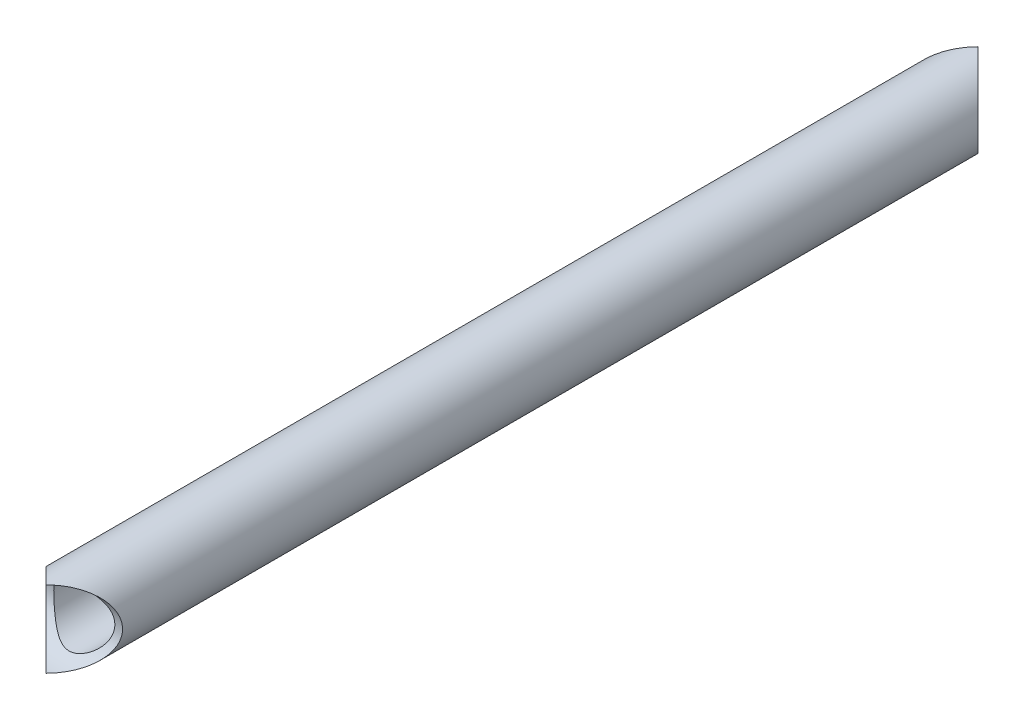
ISO-10303-21;
HEADER;
FILE_DESCRIPTION(('STEP AP214'),'2;1');
FILE_NAME('part.step','',(''),(''),'','','');
FILE_SCHEMA(('AUTOMOTIVE_DESIGN { 1 0 10303 214 1 1 1 1 }'));
ENDSEC;
DATA;
#1=APPLICATION_CONTEXT('core data for automotive mechanical design processes');
#2=APPLICATION_PROTOCOL_DEFINITION('international standard','automotive_design',2000,#1);
#3=PRODUCT_CONTEXT('',#1,'mechanical');
#4=PRODUCT('Part','Part','',(#3));
#5=PRODUCT_RELATED_PRODUCT_CATEGORY('part','',(#4));
#6=PRODUCT_DEFINITION_FORMATION('','',#4);
#7=PRODUCT_DEFINITION_CONTEXT('part definition',#1,'design');
#8=PRODUCT_DEFINITION('design','',#6,#7);
#9=PRODUCT_DEFINITION_SHAPE('','',#8);
#10=(LENGTH_UNIT() NAMED_UNIT(*) SI_UNIT(.MILLI.,.METRE.));
#11=(NAMED_UNIT(*) PLANE_ANGLE_UNIT() SI_UNIT($,.RADIAN.));
#12=(NAMED_UNIT(*) SI_UNIT($,.STERADIAN.) SOLID_ANGLE_UNIT());
#13=UNCERTAINTY_MEASURE_WITH_UNIT(LENGTH_MEASURE(1.E-05),#10,'distance_accuracy_value','');
#14=(GEOMETRIC_REPRESENTATION_CONTEXT(3) GLOBAL_UNCERTAINTY_ASSIGNED_CONTEXT((#13)) GLOBAL_UNIT_ASSIGNED_CONTEXT((#10,
#11,#12)) REPRESENTATION_CONTEXT('',''));
#15=CARTESIAN_POINT('',(0.,0.,0.));
#16=DIRECTION('',(0.,0.,1.));
#17=DIRECTION('',(1.,0.,0.));
#18=AXIS2_PLACEMENT_3D('',#15,#16,#17);
#19=CARTESIAN_POINT('',(44.45,0.,406.4));
#20=DIRECTION('',(1.,0.,0.));
#21=DIRECTION('',(0.,1.,0.));
#22=AXIS2_PLACEMENT_3D('',#19,#20,#21);
#23=CYLINDRICAL_SURFACE('',#22,16.7005);
#24=CARTESIAN_POINT('',(0.,0.,406.4));
#25=DIRECTION('',(0.707106781186548,0.,-0.707106781186547));
#26=DIRECTION('',(0.707106781186547,0.,0.707106781186548));
#27=AXIS2_PLACEMENT_3D('',#24,#25,#26);
#28=ELLIPSE('',#27,23.6180735984119,16.7005);
#29=CARTESIAN_POINT('',(0.,-16.7005,406.4));
#30=VERTEX_POINT('',#29);
#31=CARTESIAN_POINT('',(0.,16.7005,406.4));
#32=VERTEX_POINT('',#31);
#33=EDGE_CURVE('E36',#30,#32,#28,.T.);
#34=ORIENTED_EDGE('',*,*,#33,.F.);
#35=CARTESIAN_POINT('',(0.,0.,406.4));
#36=DIRECTION('',(-0.707106781186548,0.,-0.707106781186547));
#37=DIRECTION('',(-0.707106781186547,0.,0.707106781186548));
#38=AXIS2_PLACEMENT_3D('',#35,#36,#37);
#39=ELLIPSE('',#38,23.6180735984119,16.7005);
#40=EDGE_CURVE('E49',#32,#30,#39,.T.);
#41=ORIENTED_EDGE('',*,*,#40,.F.);
#42=EDGE_LOOP('',(#34,#41));
#43=FACE_BOUND('',#42,.T.);
#44=CARTESIAN_POINT('',(0.,13.3223,396.329100191145));
#45=CARTESIAN_POINT('',(0.251418143500062,13.3223022843708,396.32910557351));
#46=CARTESIAN_POINT('',(0.502811293762392,13.315168722087,396.319646331603));
#47=CARTESIAN_POINT('',(1.00339356073242,13.2868247388992,396.282315522625));
#48=CARTESIAN_POINT('',(1.2525828654249,13.2656155305941,396.254445541617));
#49=CARTESIAN_POINT('',(1.74736485458092,13.2095619602766,396.181572093699));
#50=CARTESIAN_POINT('',(1.99294933205383,13.1746903626753,396.136534408338));
#51=CARTESIAN_POINT('',(2.47865035470146,13.092009190743,396.031274830452));
#52=CARTESIAN_POINT('',(2.71876504043032,13.0441952858102,395.971047855928));
#53=CARTESIAN_POINT('',(3.27462578986355,12.9177201172076,395.814513766992));
#54=CARTESIAN_POINT('',(3.58776375820546,12.8341105283272,395.712934977466));
#55=CARTESIAN_POINT('',(4.20127254631732,12.6465806454139,395.491667867288));
#56=CARTESIAN_POINT('',(4.50163821678405,12.5426522523861,395.371972329683));
#57=CARTESIAN_POINT('',(5.0900128010856,12.3156449633207,395.119019161268));
#58=CARTESIAN_POINT('',(5.37799045091787,12.1925208700847,394.985729786044));
#59=CARTESIAN_POINT('',(5.94093329980695,11.9283554466745,394.709938872621));
#60=CARTESIAN_POINT('',(6.21589865064841,11.7873143255679,394.567437441924));
#61=CARTESIAN_POINT('',(6.84888646199477,11.434618334165,394.224769458562));
#62=CARTESIAN_POINT('',(7.20156650728618,11.2157165682894,394.022158571064));
#63=CARTESIAN_POINT('',(7.88371776304454,10.7471818668879,393.613225526753));
#64=CARTESIAN_POINT('',(8.21318075270779,10.4975381312124,393.406902087521));
#65=CARTESIAN_POINT('',(8.84806966939785,9.96824901074904,392.996538331912));
#66=CARTESIAN_POINT('',(9.15351433918057,9.68862743019638,392.792496344039));
#67=CARTESIAN_POINT('',(9.73930744068205,9.09956019954305,392.391732679595));
#68=CARTESIAN_POINT('',(10.0196641269316,8.79012442911115,392.195008607798));
#69=CARTESIAN_POINT('',(10.5008423920522,8.20547294017991,391.851175902972));
#70=CARTESIAN_POINT('',(10.706470867041,7.93547114854484,391.701910676446));
#71=CARTESIAN_POINT('',(11.0987661821715,7.37682281423733,391.413742360671));
#72=CARTESIAN_POINT('',(11.2854366739121,7.08817987972419,391.274837277275));
#73=CARTESIAN_POINT('',(11.6379110681395,6.49323527631221,391.010052309959));
#74=CARTESIAN_POINT('',(11.8037395993659,6.18695508561281,390.884157084314));
#75=CARTESIAN_POINT('',(12.1128258466353,5.55751622852175,390.647741045362));
#76=CARTESIAN_POINT('',(12.2560872832031,5.2343603560617,390.537217698122));
#77=CARTESIAN_POINT('',(12.4968974840105,4.62605154757625,390.350368325039));
#78=CARTESIAN_POINT('',(12.5980925515534,4.34314964550611,390.271401259523));
#79=CARTESIAN_POINT('',(12.7819172205302,3.76794233665668,390.127410677802));
#80=CARTESIAN_POINT('',(12.8645503449827,3.47563872636239,390.06238451575));
#81=CARTESIAN_POINT('',(13.0101137461755,2.88332875196879,389.947520429974));
#82=CARTESIAN_POINT('',(13.0730505855828,2.58332498963359,389.897677447467));
#83=CARTESIAN_POINT('',(13.1783068439696,1.97748001231227,389.814169706927));
#84=CARTESIAN_POINT('',(13.2206260161555,1.67163872749646,389.780505142551));
#85=CARTESIAN_POINT('',(13.2840628144823,1.05529732744196,389.72999768737));
#86=CARTESIAN_POINT('',(13.3051065163602,0.744784746931243,389.71321345041));
#87=CARTESIAN_POINT('',(13.325371652977,0.122591545373536,389.697050711049));
#88=CARTESIAN_POINT('',(13.3245930460588,-0.189089077902027,389.697672241875));
#89=CARTESIAN_POINT('',(13.3012271283397,-0.811115504501908,389.716306854107));
#90=CARTESIAN_POINT('',(13.2786390010251,-1.12146125741387,389.734320586649));
#91=CARTESIAN_POINT('',(13.2120407141424,-1.73836345548137,389.787335049311));
#92=CARTESIAN_POINT('',(13.168031033991,-2.04491998528271,389.822335399268));
#93=CARTESIAN_POINT('',(13.0622432818108,-2.63564529534356,389.906236163795));
#94=CARTESIAN_POINT('',(13.0015491768648,-2.92013092342892,389.954286942744));
#95=CARTESIAN_POINT('',(12.8624621699321,-3.48202701063419,390.064023430465));
#96=CARTESIAN_POINT('',(12.7840700518669,-3.75943778252455,390.125708535312));
#97=CARTESIAN_POINT('',(12.6105537381184,-4.30578333855933,390.261654896973));
#98=CARTESIAN_POINT('',(12.5154299542741,-4.5747183311374,390.33591584424));
#99=CARTESIAN_POINT('',(12.3094530772396,-5.10308574066141,390.495866980434));
#100=CARTESIAN_POINT('',(12.1985942291035,-5.3625146369738,390.581561350334));
#101=CARTESIAN_POINT('',(11.9508087552412,-5.89545039377881,390.771885546172));
#102=CARTESIAN_POINT('',(11.8123988735205,-6.16789944276706,390.877544667385));
#103=CARTESIAN_POINT('',(11.5192374839682,-6.69948001358185,391.099455041337));
#104=CARTESIAN_POINT('',(11.3644792235541,-6.95860596618139,391.215710668147));
#105=CARTESIAN_POINT('',(11.0398574678803,-7.46291984015722,391.45711896307));
#106=CARTESIAN_POINT('',(10.8699913201269,-7.70810530156343,391.582273192736));
#107=CARTESIAN_POINT('',(10.5162313045658,-8.18416297618833,391.839799548984));
#108=CARTESIAN_POINT('',(10.3323355514131,-8.41503325810209,391.972172644979));
#109=CARTESIAN_POINT('',(9.91221062050685,-8.90826660816847,392.270289547353));
#110=CARTESIAN_POINT('',(9.67299980599328,-9.16733289213357,392.437294629016));
#111=CARTESIAN_POINT('',(9.1766861958105,-9.66413138458373,392.77642700289));
#112=CARTESIAN_POINT('',(8.9195804316629,-9.9018600384593,392.948555142208));
#113=CARTESIAN_POINT('',(8.38798986657646,-10.3560450780744,393.29501284288));
#114=CARTESIAN_POINT('',(8.11348561530664,-10.5724769403747,393.46934468718));
#115=CARTESIAN_POINT('',(7.54777686996103,-10.98348665511,393.816595767305));
#116=CARTESIAN_POINT('',(7.2565744532504,-11.1780672171231,393.989515175803));
#117=CARTESIAN_POINT('',(6.68818598986019,-11.5261100140999,394.312570764624));
#118=CARTESIAN_POINT('',(6.41262328051089,-11.6817425808608,394.463225333283));
#119=CARTESIAN_POINT('',(5.84781146813716,-11.9744711681619,394.756902909549));
#120=CARTESIAN_POINT('',(5.55856090563274,-12.1115652059752,394.899925099871));
#121=CARTESIAN_POINT('',(4.96670188985605,-12.366048087,395.174027100627));
#122=CARTESIAN_POINT('',(4.6641172959576,-12.4834704551977,395.30512705124));
#123=CARTESIAN_POINT('',(4.04518266334866,-12.697530388079,395.550762177573));
#124=CARTESIAN_POINT('',(3.72883883549659,-12.7941772160494,395.665304728324));
#125=CARTESIAN_POINT('',(3.17897999564315,-12.9395862594659,395.841461999184));
#126=CARTESIAN_POINT('',(2.94876385555744,-12.9940455688101,395.908693369207));
#127=CARTESIAN_POINT('',(2.48248847766133,-13.0911266038004,396.03008438146));
#128=CARTESIAN_POINT('',(2.24643114282422,-13.1337521308253,396.084248220654));
#129=CARTESIAN_POINT('',(1.7698502096627,-13.2064109950073,396.177431316034));
#130=CARTESIAN_POINT('',(1.52933537855158,-13.2364667736619,396.216477553214));
#131=CARTESIAN_POINT('',(1.04489137463386,-13.2834892177118,396.277889355234));
#132=CARTESIAN_POINT('',(0.800962273048963,-13.3004561557274,396.3002552675));
#133=CARTESIAN_POINT('',(0.310169920058728,-13.3209655979565,396.327320363423));
#134=CARTESIAN_POINT('',(0.0632978839862458,-13.3244321843177,396.33191963703));
#135=CARTESIAN_POINT('',(-0.429916268092036,-13.3176454396277,396.322944449436));
#136=CARTESIAN_POINT('',(-0.676258391564789,-13.3073923031851,396.309370246018));
#137=CARTESIAN_POINT('',(-1.16668953432511,-13.273394972809,396.264692229071));
#138=CARTESIAN_POINT('',(-1.41077544456566,-13.2496343652269,396.233567088836));
#139=CARTESIAN_POINT('',(-1.89470167325925,-13.1891350878875,396.155203873801));
#140=CARTESIAN_POINT('',(-2.1345413342501,-13.1523944265195,396.107963326352));
#141=CARTESIAN_POINT('',(-2.67043743013834,-13.055444340755,395.985122112423));
#142=CARTESIAN_POINT('',(-2.96488067924536,-12.9916156658252,395.905340371646));
#143=CARTESIAN_POINT('',(-3.54353431865189,-12.8458618316345,395.727431242282));
#144=CARTESIAN_POINT('',(-3.82774143977868,-12.7639309495355,395.629298053573));
#145=CARTESIAN_POINT('',(-4.3859470391057,-12.5830615993919,395.418534933513));
#146=CARTESIAN_POINT('',(-4.65991896444466,-12.4840821897831,395.305870272733));
#147=CARTESIAN_POINT('',(-5.19680621280208,-12.2703048545864,395.069876716961));
#148=CARTESIAN_POINT('',(-5.45972105744592,-12.1555062455121,394.946547361275));
#149=CARTESIAN_POINT('',(-6.09016044800816,-11.855977234073,394.63532084713));
#150=CARTESIAN_POINT('',(-6.45172372019434,-11.6629726111794,394.443270483761));
#151=CARTESIAN_POINT('',(-7.15248845881102,-11.2468532321984,394.051037159809));
#152=CARTESIAN_POINT('',(-7.49168087690596,-11.02372640242,393.850850960796));
#153=CARTESIAN_POINT('',(-8.14795348263769,-10.5479343203214,393.448359741947));
#154=CARTESIAN_POINT('',(-8.46501211173744,-10.2952408934804,393.246052871149));
#155=CARTESIAN_POINT('',(-9.07595588785152,-9.76090905635812,392.844816663838));
#156=CARTESIAN_POINT('',(-9.36984458613353,-9.47927509710918,392.64588681341));
#157=CARTESIAN_POINT('',(-9.9368377916864,-8.8833704905327,392.253574302747));
#158=CARTESIAN_POINT('',(-10.2096176292959,-8.56871889612704,392.060299190766));
#159=CARTESIAN_POINT('',(-10.72785141761,-7.91027072875489,391.68682312133));
#160=CARTESIAN_POINT('',(-10.9733011389647,-7.56646965935182,391.506624188918));
#161=CARTESIAN_POINT('',(-11.4332199774545,-6.85166205140221,391.164580944834));
#162=CARTESIAN_POINT('',(-11.6477726953282,-6.48073318353379,391.002687368181));
#163=CARTESIAN_POINT('',(-12.0430648751614,-5.71266358035511,390.701527119461));
#164=CARTESIAN_POINT('',(-12.2238235736237,-5.31553793223436,390.562247580826));
#165=CARTESIAN_POINT('',(-12.4953516830537,-4.63017335700702,390.351570520135));
#166=CARTESIAN_POINT('',(-12.5963283907563,-4.34820053067243,390.272778718469));
#167=CARTESIAN_POINT('',(-12.7798386638517,-3.77490569845387,390.129043150216));
#168=CARTESIAN_POINT('',(-12.8623770210169,-3.48358614416387,390.064095785927));
#169=CARTESIAN_POINT('',(-13.0078678041303,-2.89333645974646,389.949296290145));
#170=CARTESIAN_POINT('',(-13.0708305992168,-2.59441044984041,389.899436167344));
#171=CARTESIAN_POINT('',(-13.1762884157818,-1.99072341644601,389.815773544255));
#172=CARTESIAN_POINT('',(-13.2187826965146,-1.68596218219861,389.781971625108));
#173=CARTESIAN_POINT('',(-13.2827219293065,-1.07174753240294,389.731066373826));
#174=CARTESIAN_POINT('',(-13.3040919429578,-0.762281338594913,389.714022492017));
#175=CARTESIAN_POINT('',(-13.3251538129713,-0.142140924713608,389.697224590726));
#176=CARTESIAN_POINT('',(-13.3248457583348,0.16853329039478,389.697470500259));
#177=CARTESIAN_POINT('',(-13.302556580212,0.788625979462961,389.715246783976));
#178=CARTESIAN_POINT('',(-13.2805737344486,1.09804435167176,389.732778531692));
#179=CARTESIAN_POINT('',(-13.2153077585039,1.71317834877024,389.784736165546));
#180=CARTESIAN_POINT('',(-13.1720250434862,2.01889404571114,389.819161722401));
#181=CARTESIAN_POINT('',(-13.0676009318225,2.60895435014121,389.901992167692));
#182=CARTESIAN_POINT('',(-13.0074817075329,2.89359424390586,389.949595510683));
#183=CARTESIAN_POINT('',(-12.8695210762881,3.45584951803283,390.05846394116));
#184=CARTESIAN_POINT('',(-12.7916804137679,3.73346519292152,390.119728454769));
#185=CARTESIAN_POINT('',(-12.6192395905063,4.28026388297343,390.254865652579));
#186=CARTESIAN_POINT('',(-12.5246397777822,4.54944707310741,390.328738074967));
#187=CARTESIAN_POINT('',(-12.3196820362639,5.07834513386477,390.487947240024));
#188=CARTESIAN_POINT('',(-12.2093183375125,5.33805649368527,390.573288179764));
#189=CARTESIAN_POINT('',(-11.9626774379795,5.8713165570124,390.762805210544));
#190=CARTESIAN_POINT('',(-11.8249327634228,6.14382340634789,390.868001349042));
#191=CARTESIAN_POINT('',(-11.5331023411829,6.67557225973814,391.089010861412));
#192=CARTESIAN_POINT('',(-11.3790098443269,6.93480871914068,391.204828617707));
#193=CARTESIAN_POINT('',(-11.0557186899751,7.43939264187105,391.445393004403));
#194=CARTESIAN_POINT('',(-10.8865172777512,7.68473755904838,391.57014126223));
#195=CARTESIAN_POINT('',(-10.5340880539811,8.16115706344405,391.826892482345));
#196=CARTESIAN_POINT('',(-10.3508583548458,8.39222972266114,391.958896420252));
#197=CARTESIAN_POINT('',(-9.93228458047709,8.88586217152219,392.25619124346));
#198=CARTESIAN_POINT('',(-9.69396627295106,9.14514133178592,392.422750355445));
#199=CARTESIAN_POINT('',(-9.19946404739427,9.64243434741766,392.761062342446));
#200=CARTESIAN_POINT('',(-8.94327724976101,9.88044476104951,392.93281605206));
#201=CARTESIAN_POINT('',(-8.4135970741645,10.3352328926815,393.278592822194));
#202=CARTESIAN_POINT('',(-8.14008672465534,10.551989241884,393.452617971265));
#203=CARTESIAN_POINT('',(-7.57641216895616,10.9637345825343,393.799379575858));
#204=CARTESIAN_POINT('',(-7.28624974838448,11.1587259012892,393.972116167317));
#205=CARTESIAN_POINT('',(-6.71834841090559,11.5085877494038,394.295858094397));
#206=CARTESIAN_POINT('',(-6.44215048597984,11.6655161270902,394.447341792226));
#207=CARTESIAN_POINT('',(-5.87599491910132,11.9606981897759,394.742728134272));
#208=CARTESIAN_POINT('',(-5.58603645653182,12.0989507591378,394.886630325279));
#209=CARTESIAN_POINT('',(-4.99232911285802,12.355760263006,395.16267935805));
#210=CARTESIAN_POINT('',(-4.68859184469414,12.4743334048253,395.294835831101));
#211=CARTESIAN_POINT('',(-4.22265172526176,12.6364517239241,395.480587576664));
#212=CARTESIAN_POINT('',(-4.0656311208414,12.6878635336616,395.540419328904));
#213=CARTESIAN_POINT('',(-3.74810285151825,12.7852648682294,395.65526326875));
#214=CARTESIAN_POINT('',(-3.58759383561006,12.8312522462964,395.710273546019));
#215=CARTESIAN_POINT('',(-3.15392994399312,12.9466322556904,395.849915701629));
#216=CARTESIAN_POINT('',(-2.87774279418696,13.0109181280207,395.929533149367));
#217=CARTESIAN_POINT('',(-2.31722139310461,13.1223376259151,396.069511470007));
#218=CARTESIAN_POINT('',(-2.0328908661556,13.169478961459,396.129880997281));
#219=CARTESIAN_POINT('',(-1.45882116723087,13.2453399364386,396.227904264249));
#220=CARTESIAN_POINT('',(-1.1691028616004,13.2741196587628,396.265632067905));
#221=CARTESIAN_POINT('',(-0.586244542694623,13.3125962850914,396.316224191841));
#222=CARTESIAN_POINT('',(-0.293105287088509,13.3222973368622,396.32909391634));
#223=CARTESIAN_POINT('',(0.,13.3223,396.329100191145));
#224=B_SPLINE_CURVE_WITH_KNOTS('',3,(#44,#45,#46,#47,#48,#49,#50,#51,#52,#53,#54,#55,#56,#57,
#58,#59,#60,#61,#62,#63,#64,#65,#66,#67,#68,#69,#70,#71,#72,#73,#74,#75,#76,#77,#78,#79,#80,#81,
#82,#83,#84,#85,#86,#87,#88,#89,#90,#91,#92,#93,#94,#95,#96,#97,#98,#99,#100,#101,#102,#103,
#104,#105,#106,#107,#108,#109,#110,#111,#112,#113,#114,#115,#116,#117,#118,#119,#120,#121,#122,
#123,#124,#125,#126,#127,#128,#129,#130,#131,#132,#133,#134,#135,#136,#137,#138,#139,#140,#141,
#142,#143,#144,#145,#146,#147,#148,#149,#150,#151,#152,#153,#154,#155,#156,#157,#158,#159,#160,
#161,#162,#163,#164,#165,#166,#167,#168,#169,#170,#171,#172,#173,#174,#175,#176,#177,#178,#179,
#180,#181,#182,#183,#184,#185,#186,#187,#188,#189,#190,#191,#192,#193,#194,#195,#196,#197,#198,
#199,#200,#201,#202,#203,#204,#205,#206,#207,#208,#209,#210,#211,#212,#213,#214,#215,#216,#217,
#218,#219,#220,#221,#222,#223),.UNSPECIFIED.,.T.,.F.,(4,2,2,2,2,2,2,2,2,2,2,2,2,2,2,2,2,2,2,2,2,
2,2,2,2,2,2,2,2,2,2,2,2,2,2,2,2,2,2,2,2,2,2,2,2,2,2,2,2,2,2,2,2,2,2,2,2,2,2,2,2,2,2,2,2,2,2,2,2,
2,2,2,2,2,2,2,2,2,2,2,2,2,2,2,2,2,2,2,2,4),(0.,0.753939053734587,1.50781316501342,
2.26319781287562,3.01883553173926,4.0361822775201,5.0539353634849,6.07412203304001,
7.09429679948221,8.47822083041246,9.86263245071177,11.2459527938819,12.6288163059794,
13.7401029793393,14.8511751942238,15.9609218685543,17.0704853925515,18.0015271162719,
18.9323919806002,19.8629463561121,20.7935118700988,21.7272997507215,22.6610894138783,
23.5949140379805,24.5287177639433,25.4122561187822,26.2957553455585,27.1792328286246,
28.0630342715602,29.0321340522578,30.0016356895669,30.9713078796869,31.9411106078913,
33.1104957272027,34.2800752927716,35.4509862542923,36.6217518612507,37.6724993891425,
38.7233592075191,39.7724094909819,40.8209910548434,41.5581972147829,42.29516628644,
43.0308139289689,43.7664462486832,44.5062093988458,45.2459620558771,45.986615553176,
46.7273827429545,47.660926453629,48.5947657185013,49.5308796623542,50.467034064755,
51.823002433432,53.1795159289034,54.5373327616513,55.8949410748522,57.2704275281883,
58.6461265438159,60.0180303014355,61.3891507393423,62.3173548010803,63.2453173591016,
64.1727875363499,65.1002912757801,66.031073654602,66.9618522120029,67.8927047349442,
68.8235391150133,69.70695104393,70.5903258696842,71.4736823535997,72.3573629995155,
73.3253037649047,74.2936457097676,75.2621645691659,76.2308139783262,77.3984136624844,
78.5662019482732,79.7351525400557,80.903978017455,81.959003900902,83.0140927806169,
84.0683083659166,84.5953177867069,85.1225350809318,86.0049729715281,86.8870135334627,
87.7661528749165,88.6451010674206),.UNSPECIFIED.);
#225=CARTESIAN_POINT('',(0.,13.3223,396.329100191145));
#226=VERTEX_POINT('',#225);
#227=EDGE_CURVE('E10',#226,#226,#224,.F.);
#228=ORIENTED_EDGE('',*,*,#227,.F.);
#229=EDGE_LOOP('',(#228));
#230=FACE_BOUND('',#229,.T.);
#231=ADVANCED_FACE('F16',(#43,#230),#23,.F.);
#232=CARTESIAN_POINT('',(44.4499999999999,0.,0.));
#233=DIRECTION('',(-1.,0.,0.));
#234=DIRECTION('',(0.,0.,1.));
#235=AXIS2_PLACEMENT_3D('',#232,#233,#234);
#236=CYLINDRICAL_SURFACE('',#235,16.7005);
#237=CARTESIAN_POINT('',(0.,0.,0.));
#238=DIRECTION('',(0.707106781186548,0.,0.707106781186548));
#239=DIRECTION('',(0.707106781186548,0.,-0.707106781186548));
#240=AXIS2_PLACEMENT_3D('',#237,#238,#239);
#241=ELLIPSE('',#240,23.6180735984119,16.7005);
#242=CARTESIAN_POINT('',(0.,16.7005,0.));
#243=VERTEX_POINT('',#242);
#244=CARTESIAN_POINT('',(0.,-16.7005,0.));
#245=VERTEX_POINT('',#244);
#246=EDGE_CURVE('E44',#243,#245,#241,.T.);
#247=ORIENTED_EDGE('',*,*,#246,.F.);
#248=CARTESIAN_POINT('',(0.,0.,0.));
#249=DIRECTION('',(-0.707106781186548,0.,0.707106781186548));
#250=DIRECTION('',(-0.707106781186548,0.,-0.707106781186548));
#251=AXIS2_PLACEMENT_3D('',#248,#249,#250);
#252=ELLIPSE('',#251,23.6180735984119,16.7005);
#253=EDGE_CURVE('E48',#245,#243,#252,.T.);
#254=ORIENTED_EDGE('',*,*,#253,.F.);
#255=EDGE_LOOP('',(#247,#254));
#256=FACE_BOUND('',#255,.T.);
#257=CARTESIAN_POINT('',(0.,-13.3223,10.0708998088552));
#258=CARTESIAN_POINT('',(0.251418143500058,-13.3223022843708,10.0708944264897));
#259=CARTESIAN_POINT('',(0.502811293762388,-13.315168722087,10.0803536683972));
#260=CARTESIAN_POINT('',(1.00339356073242,-13.2868247388992,10.117684477375));
#261=CARTESIAN_POINT('',(1.25258286542489,-13.2656155305941,10.1455544583827));
#262=CARTESIAN_POINT('',(1.74736485458092,-13.2095619602766,10.2184279063007));
#263=CARTESIAN_POINT('',(1.99294933205382,-13.1746903626753,10.2634655916618));
#264=CARTESIAN_POINT('',(2.47865035470145,-13.092009190743,10.368725169548));
#265=CARTESIAN_POINT('',(2.71876504043031,-13.0441952858102,10.428952144072));
#266=CARTESIAN_POINT('',(3.27462578986354,-12.9177201172076,10.5854862330085));
#267=CARTESIAN_POINT('',(3.58776375820544,-12.8341105283272,10.6870650225342));
#268=CARTESIAN_POINT('',(4.20127254631729,-12.6465806454139,10.9083321327116));
#269=CARTESIAN_POINT('',(4.50163821678403,-12.5426522523861,11.0280276703168));
#270=CARTESIAN_POINT('',(5.09001280108557,-12.3156449633207,11.2809808387316));
#271=CARTESIAN_POINT('',(5.37799045091784,-12.1925208700848,11.4142702139562));
#272=CARTESIAN_POINT('',(5.94093329980692,-11.9283554466746,11.6900611273794));
#273=CARTESIAN_POINT('',(6.21589865064839,-11.7873143255679,11.8325625580763));
#274=CARTESIAN_POINT('',(6.84888646199477,-11.434618334165,12.1752305414378));
#275=CARTESIAN_POINT('',(7.20156650728618,-11.2157165682894,12.3778414289356));
#276=CARTESIAN_POINT('',(7.88371776304454,-10.7471818668879,12.7867744732474));
#277=CARTESIAN_POINT('',(8.21318075270779,-10.4975381312124,12.9930979124795));
#278=CARTESIAN_POINT('',(8.84806966939784,-9.96824901074905,13.4034616680883));
#279=CARTESIAN_POINT('',(9.15351433918056,-9.68862743019639,13.6075036559608));
#280=CARTESIAN_POINT('',(9.73930744068203,-9.09956019954307,14.0082673204052));
#281=CARTESIAN_POINT('',(10.0196641269316,-8.79012442911117,14.2049913922016));
#282=CARTESIAN_POINT('',(10.5008423920522,-8.20547294017993,14.5488240970278));
#283=CARTESIAN_POINT('',(10.706470867041,-7.93547114854486,14.6980893235544));
#284=CARTESIAN_POINT('',(11.0987661821715,-7.37682281423735,14.9862576393288));
#285=CARTESIAN_POINT('',(11.2854366739121,-7.0881798797242,15.1251627227251));
#286=CARTESIAN_POINT('',(11.6379110681395,-6.49323527631222,15.3899476900413));
#287=CARTESIAN_POINT('',(11.8037395993659,-6.18695508561282,15.5158429156864));
#288=CARTESIAN_POINT('',(12.1128258466353,-5.55751622852176,15.7522589546384));
#289=CARTESIAN_POINT('',(12.2560872832031,-5.23436035606171,15.8627823018779));
#290=CARTESIAN_POINT('',(12.4968974840104,-4.62605154757628,16.0496316749612));
#291=CARTESIAN_POINT('',(12.5980925515534,-4.34314964550614,16.1285987404772));
#292=CARTESIAN_POINT('',(12.7819172205302,-3.76794233665672,16.2725893221979));
#293=CARTESIAN_POINT('',(12.8645503449827,-3.47563872636242,16.3376154842504));
#294=CARTESIAN_POINT('',(13.0101137461755,-2.88332875196882,16.4524795700261));
#295=CARTESIAN_POINT('',(13.0730505855828,-2.58332498963362,16.5023225525329));
#296=CARTESIAN_POINT('',(13.1783068439696,-1.9774800123123,16.5858302930726));
#297=CARTESIAN_POINT('',(13.2206260161555,-1.6716387274965,16.6194948574494));
#298=CARTESIAN_POINT('',(13.2840628144823,-1.055297327442,16.6700023126295));
#299=CARTESIAN_POINT('',(13.3051065163602,-0.744784746931284,16.68678654959));
#300=CARTESIAN_POINT('',(13.325371652977,-0.122591545373578,16.7029492889509));
#301=CARTESIAN_POINT('',(13.3245930460588,0.189089077901986,16.7023277581249));
#302=CARTESIAN_POINT('',(13.3012271283397,0.811115504501866,16.683693145893));
#303=CARTESIAN_POINT('',(13.2786390010252,1.12146125741383,16.6656794133509));
#304=CARTESIAN_POINT('',(13.2120407141424,1.73836345548133,16.612664950689));
#305=CARTESIAN_POINT('',(13.168031033991,2.04491998528267,16.5776646007317));
#306=CARTESIAN_POINT('',(13.0622432818108,2.63564529534352,16.4937638362053));
#307=CARTESIAN_POINT('',(13.0015491768649,2.92013092342888,16.4457130572562));
#308=CARTESIAN_POINT('',(12.8624621699321,3.48202701063415,16.3359765695346));
#309=CARTESIAN_POINT('',(12.7840700518669,3.75943778252451,16.2742914646878));
#310=CARTESIAN_POINT('',(12.6105537381185,4.30578333855929,16.1383451030268));
#311=CARTESIAN_POINT('',(12.5154299542741,4.57471833113736,16.0640841557603));
#312=CARTESIAN_POINT('',(12.3094530772396,5.10308574066137,15.9041330195655));
#313=CARTESIAN_POINT('',(12.1985942291035,5.36251463697377,15.8184386496659));
#314=CARTESIAN_POINT('',(11.9508087552412,5.89545039377878,15.6281144538284));
#315=CARTESIAN_POINT('',(11.8123988735205,6.16789944276703,15.5224553326151));
#316=CARTESIAN_POINT('',(11.5192374839682,6.69948001358183,15.3005449586629));
#317=CARTESIAN_POINT('',(11.3644792235541,6.95860596618135,15.1842893318531));
#318=CARTESIAN_POINT('',(11.0398574678804,7.46291984015719,14.9428810369299));
#319=CARTESIAN_POINT('',(10.869991320127,7.70810530156339,14.8177268072643));
#320=CARTESIAN_POINT('',(10.5162313045658,8.1841629761883,14.5602004510157));
#321=CARTESIAN_POINT('',(10.3323355514131,8.41503325810206,14.4278273550215));
#322=CARTESIAN_POINT('',(9.91221062050689,8.90826660816842,14.1297104526471));
#323=CARTESIAN_POINT('',(9.67299980599334,9.16733289213351,13.9627053709843));
#324=CARTESIAN_POINT('',(9.17668619581056,9.66413138458367,13.6235729971104));
#325=CARTESIAN_POINT('',(8.91958043166295,9.90186003845924,13.4514448577919));
#326=CARTESIAN_POINT('',(8.38798986657651,10.3560450780743,13.1049871571197));
#327=CARTESIAN_POINT('',(8.1134856153067,10.5724769403747,12.9306553128202));
#328=CARTESIAN_POINT('',(7.54777686996109,10.98348665511,12.5834042326949));
#329=CARTESIAN_POINT('',(7.25657445325045,11.1780672171231,12.4104848241972));
#330=CARTESIAN_POINT('',(6.68818598986023,11.5261100140998,12.0874292353764));
#331=CARTESIAN_POINT('',(6.41262328051092,11.6817425808608,11.9367746667166));
#332=CARTESIAN_POINT('',(5.84781146813719,11.9744711681619,11.6430970904509));
#333=CARTESIAN_POINT('',(5.55856090563277,12.1115652059752,11.5000749001294));
#334=CARTESIAN_POINT('',(4.96670188985608,12.366048087,11.2259728993735));
#335=CARTESIAN_POINT('',(4.66411729595762,12.4834704551977,11.0948729487601));
#336=CARTESIAN_POINT('',(4.04518266334868,12.697530388079,10.849237822427));
#337=CARTESIAN_POINT('',(3.72883883549661,12.7941772160494,10.7346952716757));
#338=CARTESIAN_POINT('',(3.17897999564317,12.9395862594659,10.5585380008159));
#339=CARTESIAN_POINT('',(2.94876385555746,12.9940455688101,10.4913066307933));
#340=CARTESIAN_POINT('',(2.48248847766134,13.0911266038004,10.3699156185401));
#341=CARTESIAN_POINT('',(2.24643114282423,13.1337521308253,10.3157517793462));
#342=CARTESIAN_POINT('',(1.76985020966271,13.2064109950073,10.2225686839658));
#343=CARTESIAN_POINT('',(1.5293353785516,13.2364667736619,10.1835224467864));
#344=CARTESIAN_POINT('',(1.04489137463388,13.2834892177118,10.122110644766));
#345=CARTESIAN_POINT('',(0.800962273048985,13.3004561557274,10.0997447324999));
#346=CARTESIAN_POINT('',(0.310169920058754,13.3209655979565,10.0726796365774));
#347=CARTESIAN_POINT('',(0.0632978839862747,13.3244321843177,10.0680803629701));
#348=CARTESIAN_POINT('',(-0.429916268092007,13.3176454396277,10.0770555505642));
#349=CARTESIAN_POINT('',(-0.676258391564762,13.3073923031851,10.0906297539821));
#350=CARTESIAN_POINT('',(-1.16668953432508,13.273394972809,10.1353077709287));
#351=CARTESIAN_POINT('',(-1.41077544456563,13.2496343652269,10.1664329111638));
#352=CARTESIAN_POINT('',(-1.89470167325922,13.1891350878875,10.2447961261987));
#353=CARTESIAN_POINT('',(-2.13454133425007,13.1523944265195,10.2920366736479));
#354=CARTESIAN_POINT('',(-2.67043743013831,13.055444340755,10.4148778875772));
#355=CARTESIAN_POINT('',(-2.96488067924533,12.9916156658253,10.4946596283544));
#356=CARTESIAN_POINT('',(-3.54353431865185,12.8458618316345,10.672568757718));
#357=CARTESIAN_POINT('',(-3.82774143977863,12.7639309495355,10.7707019464271));
#358=CARTESIAN_POINT('',(-4.38594703910566,12.5830615993919,10.981465066487));
#359=CARTESIAN_POINT('',(-4.65991896444464,12.4840821897832,11.0941297272674));
#360=CARTESIAN_POINT('',(-5.19680621280206,12.2703048545864,11.3301232830394));
#361=CARTESIAN_POINT('',(-5.45972105744588,12.1555062455121,11.4534526387255));
#362=CARTESIAN_POINT('',(-6.09016044800811,11.855977234073,11.7646791528701));
#363=CARTESIAN_POINT('',(-6.45172372019432,11.6629726111794,11.956729516239));
#364=CARTESIAN_POINT('',(-7.152488458811,11.2468532321984,12.3489628401913));
#365=CARTESIAN_POINT('',(-7.49168087690591,11.02372640242,12.5491490392044));
#366=CARTESIAN_POINT('',(-8.14795348263763,10.5479343203214,12.9516402580531));
#367=CARTESIAN_POINT('',(-8.46501211173739,10.2952408934804,13.1539471288515));
#368=CARTESIAN_POINT('',(-9.07595588785148,9.76090905635816,13.5551833361622));
#369=CARTESIAN_POINT('',(-9.36984458613349,9.47927509710921,13.7541131865904));
#370=CARTESIAN_POINT('',(-9.93683779168636,8.88337049053274,14.1464256972527));
#371=CARTESIAN_POINT('',(-10.2096176292959,8.56871889612709,14.3397008092336));
#372=CARTESIAN_POINT('',(-10.72785141761,7.91027072875495,14.7131768786704));
#373=CARTESIAN_POINT('',(-10.9733011389646,7.56646965935188,14.8933758110818));
#374=CARTESIAN_POINT('',(-11.4332199774544,6.85166205140227,15.2354190551661));
#375=CARTESIAN_POINT('',(-11.6477726953281,6.48073318353386,15.3973126318188));
#376=CARTESIAN_POINT('',(-12.0430648751614,5.71266358035517,15.6984728805389));
#377=CARTESIAN_POINT('',(-12.2238235736237,5.31553793223442,15.8377524191741));
#378=CARTESIAN_POINT('',(-12.4953516830537,4.63017335700709,16.0484294798648));
#379=CARTESIAN_POINT('',(-12.5963283907563,4.3482005306725,16.1272212815311));
#380=CARTESIAN_POINT('',(-12.7798386638517,3.77490569845395,16.2709568497844));
#381=CARTESIAN_POINT('',(-12.8623770210169,3.48358614416395,16.3359042140728));
#382=CARTESIAN_POINT('',(-13.0078678041303,2.89333645974653,16.4507037098549));
#383=CARTESIAN_POINT('',(-13.0708305992168,2.59441044984048,16.5005638326562));
#384=CARTESIAN_POINT('',(-13.1762884157818,1.99072341644608,16.5842264557447));
#385=CARTESIAN_POINT('',(-13.2187826965146,1.68596218219868,16.6180283748925));
#386=CARTESIAN_POINT('',(-13.2827219293065,1.07174753240301,16.6689336261742));
#387=CARTESIAN_POINT('',(-13.3040919429578,0.762281338594981,16.6859775079832));
#388=CARTESIAN_POINT('',(-13.3251538129713,0.142140924713678,16.7027754092743));
#389=CARTESIAN_POINT('',(-13.3248457583348,-0.168533290394706,16.7025294997413));
#390=CARTESIAN_POINT('',(-13.302556580212,-0.788625979462887,16.684753216024));
#391=CARTESIAN_POINT('',(-13.2805737344486,-1.09804435167169,16.6672214683085));
#392=CARTESIAN_POINT('',(-13.2153077585039,-1.71317834877017,16.6152638344543));
#393=CARTESIAN_POINT('',(-13.1720250434862,-2.01889404571107,16.580838277599));
#394=CARTESIAN_POINT('',(-13.0676009318225,-2.60895435014114,16.4980078323086));
#395=CARTESIAN_POINT('',(-13.0074817075329,-2.89359424390579,16.4504044893167));
#396=CARTESIAN_POINT('',(-12.8695210762881,-3.45584951803276,16.3415360588405));
#397=CARTESIAN_POINT('',(-12.7916804137679,-3.73346519292144,16.2802715452313));
#398=CARTESIAN_POINT('',(-12.6192395905063,-4.28026388297335,16.1451343474205));
#399=CARTESIAN_POINT('',(-12.5246397777822,-4.54944707310733,16.0712619250334));
#400=CARTESIAN_POINT('',(-12.319682036264,-5.0783451338647,15.9120527599764));
#401=CARTESIAN_POINT('',(-12.2093183375125,-5.33805649368521,15.826711820236));
#402=CARTESIAN_POINT('',(-11.9626774379795,-5.87131655701235,15.637194789456));
#403=CARTESIAN_POINT('',(-11.8249327634228,-6.14382340634785,15.531998650958));
#404=CARTESIAN_POINT('',(-11.533102341183,-6.6755722597381,15.3109891385878));
#405=CARTESIAN_POINT('',(-11.3790098443269,-6.93480871914065,15.1951713822931));
#406=CARTESIAN_POINT('',(-11.0557186899751,-7.43939264187101,14.9546069955971));
#407=CARTESIAN_POINT('',(-10.8865172777513,-7.68473755904834,14.8298587377705));
#408=CARTESIAN_POINT('',(-10.5340880539812,-8.161157063444,14.5731075176553));
#409=CARTESIAN_POINT('',(-10.3508583548459,-8.39222972266109,14.4411035797485));
#410=CARTESIAN_POINT('',(-9.93228458047713,-8.88586217152214,14.1438087565399));
#411=CARTESIAN_POINT('',(-9.6939662729511,-9.14514133178588,13.9772496445547));
#412=CARTESIAN_POINT('',(-9.19946404739432,-9.64243434741762,13.6389376575544));
#413=CARTESIAN_POINT('',(-8.94327724976106,-9.88044476104947,13.4671839479398));
#414=CARTESIAN_POINT('',(-8.41359707416456,-10.3352328926814,13.1214071778064));
#415=CARTESIAN_POINT('',(-8.14008672465542,-10.5519892418839,12.9473820287353));
#416=CARTESIAN_POINT('',(-7.57641216895624,-10.9637345825342,12.6006204241424));
#417=CARTESIAN_POINT('',(-7.28624974838456,-11.1587259012891,12.4278838326835));
#418=CARTESIAN_POINT('',(-6.71834841090565,-11.5085877494038,12.1041419056026));
#419=CARTESIAN_POINT('',(-6.4421504859799,-11.6655161270902,11.9526582077739));
#420=CARTESIAN_POINT('',(-5.87599491910137,-11.9606981897759,11.6572718657282));
#421=CARTESIAN_POINT('',(-5.58603645653186,-12.0989507591377,11.5133696747207));
#422=CARTESIAN_POINT('',(-4.99232911285806,-12.3557602630059,11.2373206419503));
#423=CARTESIAN_POINT('',(-4.68859184469419,-12.4743334048253,11.1051641688993));
#424=CARTESIAN_POINT('',(-4.2226517252618,-12.6364517239241,10.9194124233361));
#425=CARTESIAN_POINT('',(-4.06563112084144,-12.6878635336616,10.8595806710955));
#426=CARTESIAN_POINT('',(-3.74810285151829,-12.7852648682294,10.7447367312496));
#427=CARTESIAN_POINT('',(-3.5875938356101,-12.8312522462964,10.6897264539806));
#428=CARTESIAN_POINT('',(-3.15392994399316,-12.9466322556904,10.5500842983709));
#429=CARTESIAN_POINT('',(-2.87774279418699,-13.0109181280207,10.4704668506328));
#430=CARTESIAN_POINT('',(-2.31722139310464,-13.1223376259151,10.3304885299927));
#431=CARTESIAN_POINT('',(-2.03289086615562,-13.169478961459,10.2701190027191));
#432=CARTESIAN_POINT('',(-1.45882116723088,-13.2453399364386,10.1720957357507));
#433=CARTESIAN_POINT('',(-1.16910286160041,-13.2741196587628,10.134367932095));
#434=CARTESIAN_POINT('',(-0.586244542694626,-13.3125962850914,10.0837758081587));
#435=CARTESIAN_POINT('',(-0.293105287088512,-13.3222973368622,10.0709060836601));
#436=CARTESIAN_POINT('',(0.,-13.3223,10.0708998088552));
#437=B_SPLINE_CURVE_WITH_KNOTS('',3,(#257,#258,#259,#260,#261,#262,#263,#264,#265,#266,#267,
#268,#269,#270,#271,#272,#273,#274,#275,#276,#277,#278,#279,#280,#281,#282,#283,#284,#285,#286,
#287,#288,#289,#290,#291,#292,#293,#294,#295,#296,#297,#298,#299,#300,#301,#302,#303,#304,#305,
#306,#307,#308,#309,#310,#311,#312,#313,#314,#315,#316,#317,#318,#319,#320,#321,#322,#323,#324,
#325,#326,#327,#328,#329,#330,#331,#332,#333,#334,#335,#336,#337,#338,#339,#340,#341,#342,#343,
#344,#345,#346,#347,#348,#349,#350,#351,#352,#353,#354,#355,#356,#357,#358,#359,#360,#361,#362,
#363,#364,#365,#366,#367,#368,#369,#370,#371,#372,#373,#374,#375,#376,#377,#378,#379,#380,#381,
#382,#383,#384,#385,#386,#387,#388,#389,#390,#391,#392,#393,#394,#395,#396,#397,#398,#399,#400,
#401,#402,#403,#404,#405,#406,#407,#408,#409,#410,#411,#412,#413,#414,#415,#416,#417,#418,#419,
#420,#421,#422,#423,#424,#425,#426,#427,#428,#429,#430,#431,#432,#433,#434,#435,#436),
.UNSPECIFIED.,.T.,.F.,(4,2,2,2,2,2,2,2,2,2,2,2,2,2,2,2,2,2,2,2,2,2,2,2,2,2,2,2,2,2,2,2,2,2,2,2,
2,2,2,2,2,2,2,2,2,2,2,2,2,2,2,2,2,2,2,2,2,2,2,2,2,2,2,2,2,2,2,2,2,2,2,2,2,2,2,2,2,2,2,2,2,2,2,2,
2,2,2,2,2,4),(0.,0.753939053734586,1.50781316501342,2.26319781287561,3.01883553173925,
4.03618227752008,5.05393536348487,6.07412203303998,7.09429679948219,8.47822083041248,
9.86263245071177,11.2459527938819,12.6288163059794,13.7401029793392,14.8511751942238,
15.9609218685543,17.0704853925515,18.0015271162719,18.9323919806002,19.8629463561121,
20.7935118700988,21.7272997507215,22.6610894138782,23.5949140379804,24.5287177639432,
25.4122561187822,26.2957553455585,27.1792328286246,28.0630342715602,29.0321340522578,
30.0016356895669,30.9713078796868,31.9411106078913,33.1104957272026,34.2800752927715,
35.4509862542923,36.6217518612506,37.6724993891425,38.7233592075191,39.7724094909819,
40.8209910548434,41.5581972147829,42.29516628644,43.0308139289689,43.7664462486832,
44.5062093988458,45.2459620558771,45.986615553176,46.7273827429545,47.660926453629,
48.5947657185013,49.5308796623542,50.467034064755,51.8230024334319,53.1795159289033,
54.5373327616513,55.8949410748522,57.2704275281882,58.6461265438158,60.0180303014354,
61.3891507393422,62.3173548010802,63.2453173591015,64.1727875363498,65.1002912757801,
66.031073654602,66.9618522120029,67.8927047349442,68.8235391150133,69.7069510439299,
70.5903258696842,71.4736823535996,72.3573629995155,73.3253037649047,74.2936457097676,
75.2621645691659,76.2308139783262,77.3984136624844,78.5662019482732,79.7351525400556,
80.903978017455,81.959003900902,83.0140927806169,84.0683083659166,84.5953177867069,
85.1225350809318,86.0049729715281,86.8870135334627,87.7661528749165,88.6451010674207),.UNSPECIFIED.);
#438=CARTESIAN_POINT('',(0.,-13.3223,10.0708998088552));
#439=VERTEX_POINT('',#438);
#440=EDGE_CURVE('E21',#439,#439,#437,.F.);
#441=ORIENTED_EDGE('',*,*,#440,.F.);
#442=EDGE_LOOP('',(#441));
#443=FACE_BOUND('',#442,.T.);
#444=ADVANCED_FACE('F51',(#256,#443),#236,.F.);
#445=CARTESIAN_POINT('',(0.,0.,0.));
#446=DIRECTION('',(0.,0.,1.));
#447=DIRECTION('',(1.,0.,0.));
#448=AXIS2_PLACEMENT_3D('',#445,#446,#447);
#449=CYLINDRICAL_SURFACE('',#448,13.3223);
#450=ORIENTED_EDGE('',*,*,#227,.T.);
#451=EDGE_LOOP('',(#450));
#452=FACE_BOUND('',#451,.T.);
#453=ORIENTED_EDGE('',*,*,#440,.T.);
#454=EDGE_LOOP('',(#453));
#455=FACE_BOUND('',#454,.T.);
#456=ADVANCED_FACE('F18',(#452,#455),#449,.F.);
#457=CARTESIAN_POINT('',(0.,0.,0.));
#458=DIRECTION('',(0.,0.,1.));
#459=DIRECTION('',(1.,0.,0.));
#460=AXIS2_PLACEMENT_3D('',#457,#458,#459);
#461=CYLINDRICAL_SURFACE('',#460,16.7005);
#462=ORIENTED_EDGE('',*,*,#33,.T.);
#463=ORIENTED_EDGE('',*,*,#40,.T.);
#464=EDGE_LOOP('',(#462,#463));
#465=FACE_BOUND('',#464,.T.);
#466=ORIENTED_EDGE('',*,*,#246,.T.);
#467=ORIENTED_EDGE('',*,*,#253,.T.);
#468=EDGE_LOOP('',(#466,#467));
#469=FACE_BOUND('',#468,.T.);
#470=ADVANCED_FACE('F47',(#465,#469),#461,.T.);
#471=CLOSED_SHELL('',(#231,#444,#456,#470));
#472=MANIFOLD_SOLID_BREP('B1',#471);
#473=ADVANCED_BREP_SHAPE_REPRESENTATION('',(#18,#472),#14);
#474=SHAPE_DEFINITION_REPRESENTATION(#9,#473);
ENDSEC;
END-ISO-10303-21;
